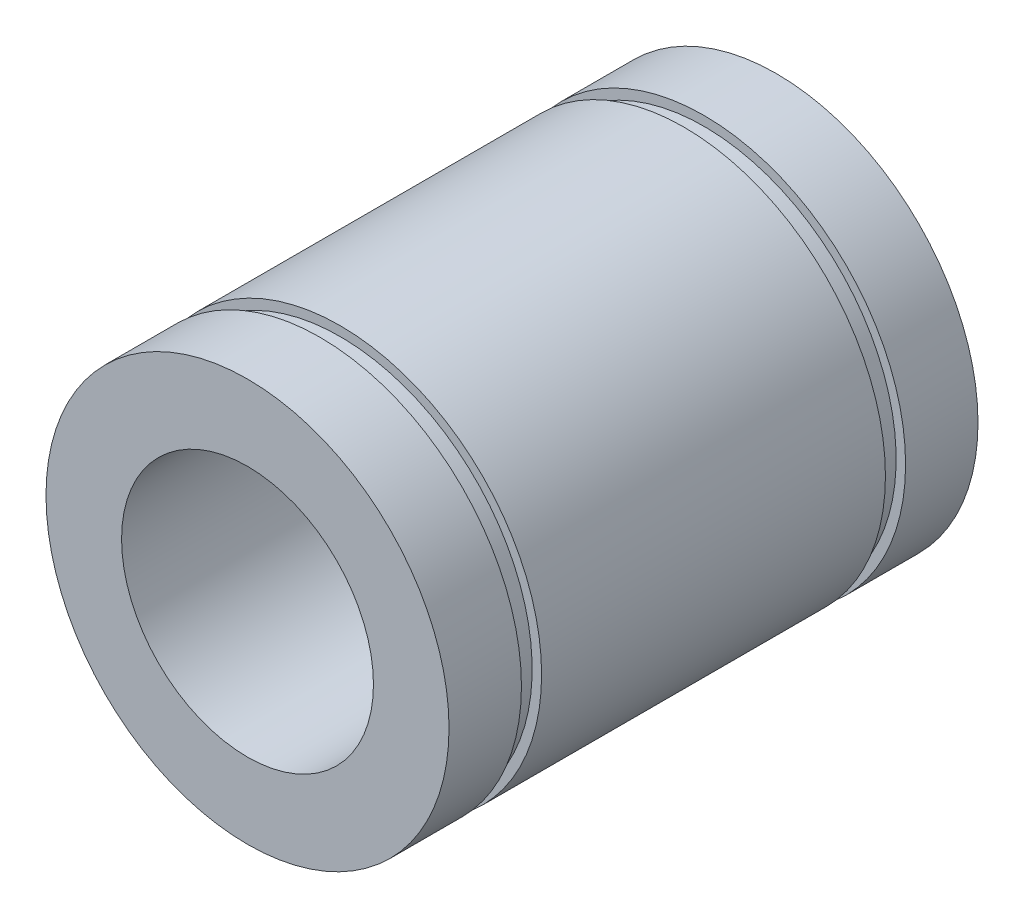
ISO-10303-21;
HEADER;
FILE_DESCRIPTION(('STEP AP214'),'2;1');
FILE_NAME('part.step','',(''),(''),'','','');
FILE_SCHEMA(('AUTOMOTIVE_DESIGN { 1 0 10303 214 1 1 1 1 }'));
ENDSEC;
DATA;
#1=APPLICATION_CONTEXT('core data for automotive mechanical design processes');
#2=APPLICATION_PROTOCOL_DEFINITION('international standard','automotive_design',2000,#1);
#3=PRODUCT_CONTEXT('',#1,'mechanical');
#4=PRODUCT('Part','Part','',(#3));
#5=PRODUCT_RELATED_PRODUCT_CATEGORY('part','',(#4));
#6=PRODUCT_DEFINITION_FORMATION('','',#4);
#7=PRODUCT_DEFINITION_CONTEXT('part definition',#1,'design');
#8=PRODUCT_DEFINITION('design','',#6,#7);
#9=PRODUCT_DEFINITION_SHAPE('','',#8);
#10=(LENGTH_UNIT() NAMED_UNIT(*) SI_UNIT(.MILLI.,.METRE.));
#11=(NAMED_UNIT(*) PLANE_ANGLE_UNIT() SI_UNIT($,.RADIAN.));
#12=(NAMED_UNIT(*) SI_UNIT($,.STERADIAN.) SOLID_ANGLE_UNIT());
#13=UNCERTAINTY_MEASURE_WITH_UNIT(LENGTH_MEASURE(1.E-05),#10,'distance_accuracy_value','');
#14=(GEOMETRIC_REPRESENTATION_CONTEXT(3) GLOBAL_UNCERTAINTY_ASSIGNED_CONTEXT((#13)) GLOBAL_UNIT_ASSIGNED_CONTEXT((#10,
#11,#12)) REPRESENTATION_CONTEXT('',''));
#15=CARTESIAN_POINT('',(0.,0.,0.));
#16=DIRECTION('',(0.,0.,1.));
#17=DIRECTION('',(1.,0.,0.));
#18=AXIS2_PLACEMENT_3D('',#15,#16,#17);
#19=CARTESIAN_POINT('',(-10.,0.,42.));
#20=DIRECTION('',(0.,0.,-1.));
#21=DIRECTION('',(-1.,0.,0.));
#22=AXIS2_PLACEMENT_3D('',#19,#20,#21);
#23=PLANE('',#22);
#24=CARTESIAN_POINT('',(0.,0.,42.));
#25=DIRECTION('',(0.,0.,-1.));
#26=DIRECTION('',(-1.,0.,0.));
#27=AXIS2_PLACEMENT_3D('',#24,#25,#26);
#28=CIRCLE('',#27,16.);
#29=CARTESIAN_POINT('',(-16.,0.,42.));
#30=VERTEX_POINT('',#29);
#31=EDGE_CURVE('E10',#30,#30,#28,.T.);
#32=ORIENTED_EDGE('',*,*,#31,.F.);
#33=EDGE_LOOP('',(#32));
#34=FACE_BOUND('',#33,.T.);
#35=CARTESIAN_POINT('',(0.,0.,42.));
#36=DIRECTION('',(0.,0.,-1.));
#37=DIRECTION('',(-1.,0.,0.));
#38=AXIS2_PLACEMENT_3D('',#35,#36,#37);
#39=CIRCLE('',#38,10.);
#40=CARTESIAN_POINT('',(-10.,0.,42.));
#41=VERTEX_POINT('',#40);
#42=EDGE_CURVE('E70',#41,#41,#39,.T.);
#43=ORIENTED_EDGE('',*,*,#42,.T.);
#44=EDGE_LOOP('',(#43));
#45=FACE_BOUND('',#44,.T.);
#46=ADVANCED_FACE('F30',(#34,#45),#23,.F.);
#47=CARTESIAN_POINT('',(0.,0.,0.));
#48=DIRECTION('',(0.,0.,-1.));
#49=DIRECTION('',(-1.,0.,0.));
#50=AXIS2_PLACEMENT_3D('',#47,#48,#49);
#51=CYLINDRICAL_SURFACE('',#50,16.);
#52=CARTESIAN_POINT('',(0.,0.,36.25));
#53=DIRECTION('',(0.,0.,-1.));
#54=DIRECTION('',(-1.,0.,0.));
#55=AXIS2_PLACEMENT_3D('',#52,#53,#54);
#56=CIRCLE('',#55,16.);
#57=CARTESIAN_POINT('',(-16.,0.,36.25));
#58=VERTEX_POINT('',#57);
#59=EDGE_CURVE('E36',#58,#58,#56,.T.);
#60=ORIENTED_EDGE('',*,*,#59,.F.);
#61=EDGE_LOOP('',(#60));
#62=FACE_BOUND('',#61,.T.);
#63=ORIENTED_EDGE('',*,*,#31,.T.);
#64=EDGE_LOOP('',(#63));
#65=FACE_BOUND('',#64,.T.);
#66=ADVANCED_FACE('F131',(#62,#65),#51,.T.);
#67=CARTESIAN_POINT('',(-16.,0.,36.25));
#68=DIRECTION('',(0.,0.,1.));
#69=DIRECTION('',(1.,0.,0.));
#70=AXIS2_PLACEMENT_3D('',#67,#68,#69);
#71=PLANE('',#70);
#72=CARTESIAN_POINT('',(0.,0.,36.25));
#73=DIRECTION('',(0.,0.,-1.));
#74=DIRECTION('',(-1.,0.,0.));
#75=AXIS2_PLACEMENT_3D('',#72,#73,#74);
#76=CIRCLE('',#75,15.25);
#77=CARTESIAN_POINT('',(-15.25,0.,36.25));
#78=VERTEX_POINT('',#77);
#79=EDGE_CURVE('E40',#78,#78,#76,.T.);
#80=ORIENTED_EDGE('',*,*,#79,.F.);
#81=EDGE_LOOP('',(#80));
#82=FACE_BOUND('',#81,.T.);
#83=ORIENTED_EDGE('',*,*,#59,.T.);
#84=EDGE_LOOP('',(#83));
#85=FACE_BOUND('',#84,.T.);
#86=ADVANCED_FACE('F126',(#82,#85),#71,.F.);
#87=CARTESIAN_POINT('',(0.,0.,0.));
#88=DIRECTION('',(0.,0.,-1.));
#89=DIRECTION('',(-1.,0.,0.));
#90=AXIS2_PLACEMENT_3D('',#87,#88,#89);
#91=CYLINDRICAL_SURFACE('',#90,15.25);
#92=CARTESIAN_POINT('',(0.,0.,34.65));
#93=DIRECTION('',(0.,0.,-1.));
#94=DIRECTION('',(-1.,0.,0.));
#95=AXIS2_PLACEMENT_3D('',#92,#93,#94);
#96=CIRCLE('',#95,15.25);
#97=CARTESIAN_POINT('',(-15.25,0.,34.65));
#98=VERTEX_POINT('',#97);
#99=EDGE_CURVE('E44',#98,#98,#96,.T.);
#100=ORIENTED_EDGE('',*,*,#99,.F.);
#101=EDGE_LOOP('',(#100));
#102=FACE_BOUND('',#101,.T.);
#103=ORIENTED_EDGE('',*,*,#79,.T.);
#104=EDGE_LOOP('',(#103));
#105=FACE_BOUND('',#104,.T.);
#106=ADVANCED_FACE('F120',(#102,#105),#91,.T.);
#107=CARTESIAN_POINT('',(-15.25,0.,34.65));
#108=DIRECTION('',(0.,0.,-1.));
#109=DIRECTION('',(-1.,0.,0.));
#110=AXIS2_PLACEMENT_3D('',#107,#108,#109);
#111=PLANE('',#110);
#112=CARTESIAN_POINT('',(0.,0.,34.65));
#113=DIRECTION('',(0.,0.,-1.));
#114=DIRECTION('',(-1.,0.,0.));
#115=AXIS2_PLACEMENT_3D('',#112,#113,#114);
#116=CIRCLE('',#115,16.);
#117=CARTESIAN_POINT('',(-16.,0.,34.65));
#118=VERTEX_POINT('',#117);
#119=EDGE_CURVE('E49',#118,#118,#116,.T.);
#120=ORIENTED_EDGE('',*,*,#119,.F.);
#121=EDGE_LOOP('',(#120));
#122=FACE_BOUND('',#121,.T.);
#123=ORIENTED_EDGE('',*,*,#99,.T.);
#124=EDGE_LOOP('',(#123));
#125=FACE_BOUND('',#124,.T.);
#126=ADVANCED_FACE('F114',(#122,#125),#111,.F.);
#127=CARTESIAN_POINT('',(0.,0.,0.));
#128=DIRECTION('',(0.,0.,-1.));
#129=DIRECTION('',(-1.,0.,0.));
#130=AXIS2_PLACEMENT_3D('',#127,#128,#129);
#131=CYLINDRICAL_SURFACE('',#130,16.);
#132=CARTESIAN_POINT('',(0.,0.,7.35));
#133=DIRECTION('',(0.,0.,-1.));
#134=DIRECTION('',(-1.,0.,0.));
#135=AXIS2_PLACEMENT_3D('',#132,#133,#134);
#136=CIRCLE('',#135,16.);
#137=CARTESIAN_POINT('',(-16.,0.,7.35));
#138=VERTEX_POINT('',#137);
#139=EDGE_CURVE('E52',#138,#138,#136,.T.);
#140=ORIENTED_EDGE('',*,*,#139,.F.);
#141=EDGE_LOOP('',(#140));
#142=FACE_BOUND('',#141,.T.);
#143=ORIENTED_EDGE('',*,*,#119,.T.);
#144=EDGE_LOOP('',(#143));
#145=FACE_BOUND('',#144,.T.);
#146=ADVANCED_FACE('F108',(#142,#145),#131,.T.);
#147=CARTESIAN_POINT('',(-16.,0.,7.35));
#148=DIRECTION('',(0.,0.,1.));
#149=DIRECTION('',(1.,0.,0.));
#150=AXIS2_PLACEMENT_3D('',#147,#148,#149);
#151=PLANE('',#150);
#152=CARTESIAN_POINT('',(0.,0.,7.35));
#153=DIRECTION('',(0.,0.,-1.));
#154=DIRECTION('',(-1.,0.,0.));
#155=AXIS2_PLACEMENT_3D('',#152,#153,#154);
#156=CIRCLE('',#155,15.25);
#157=CARTESIAN_POINT('',(-15.25,0.,7.35));
#158=VERTEX_POINT('',#157);
#159=EDGE_CURVE('E55',#158,#158,#156,.T.);
#160=ORIENTED_EDGE('',*,*,#159,.F.);
#161=EDGE_LOOP('',(#160));
#162=FACE_BOUND('',#161,.T.);
#163=ORIENTED_EDGE('',*,*,#139,.T.);
#164=EDGE_LOOP('',(#163));
#165=FACE_BOUND('',#164,.T.);
#166=ADVANCED_FACE('F102',(#162,#165),#151,.F.);
#167=CARTESIAN_POINT('',(0.,0.,0.));
#168=DIRECTION('',(0.,0.,-1.));
#169=DIRECTION('',(-1.,0.,0.));
#170=AXIS2_PLACEMENT_3D('',#167,#168,#169);
#171=CYLINDRICAL_SURFACE('',#170,15.25);
#172=CARTESIAN_POINT('',(0.,0.,5.75));
#173=DIRECTION('',(0.,0.,-1.));
#174=DIRECTION('',(-1.,0.,0.));
#175=AXIS2_PLACEMENT_3D('',#172,#173,#174);
#176=CIRCLE('',#175,15.25);
#177=CARTESIAN_POINT('',(-15.25,0.,5.75));
#178=VERTEX_POINT('',#177);
#179=EDGE_CURVE('E58',#178,#178,#176,.T.);
#180=ORIENTED_EDGE('',*,*,#179,.F.);
#181=EDGE_LOOP('',(#180));
#182=FACE_BOUND('',#181,.T.);
#183=ORIENTED_EDGE('',*,*,#159,.T.);
#184=EDGE_LOOP('',(#183));
#185=FACE_BOUND('',#184,.T.);
#186=ADVANCED_FACE('F96',(#182,#185),#171,.T.);
#187=CARTESIAN_POINT('',(-15.25,0.,5.75));
#188=DIRECTION('',(0.,0.,-1.));
#189=DIRECTION('',(-1.,0.,0.));
#190=AXIS2_PLACEMENT_3D('',#187,#188,#189);
#191=PLANE('',#190);
#192=CARTESIAN_POINT('',(0.,0.,5.75));
#193=DIRECTION('',(0.,0.,-1.));
#194=DIRECTION('',(-1.,0.,0.));
#195=AXIS2_PLACEMENT_3D('',#192,#193,#194);
#196=CIRCLE('',#195,16.);
#197=CARTESIAN_POINT('',(-16.,0.,5.75));
#198=VERTEX_POINT('',#197);
#199=EDGE_CURVE('E61',#198,#198,#196,.T.);
#200=ORIENTED_EDGE('',*,*,#199,.F.);
#201=EDGE_LOOP('',(#200));
#202=FACE_BOUND('',#201,.T.);
#203=ORIENTED_EDGE('',*,*,#179,.T.);
#204=EDGE_LOOP('',(#203));
#205=FACE_BOUND('',#204,.T.);
#206=ADVANCED_FACE('F90',(#202,#205),#191,.F.);
#207=CARTESIAN_POINT('',(0.,0.,0.));
#208=DIRECTION('',(0.,0.,-1.));
#209=DIRECTION('',(-1.,0.,0.));
#210=AXIS2_PLACEMENT_3D('',#207,#208,#209);
#211=CYLINDRICAL_SURFACE('',#210,16.);
#212=CARTESIAN_POINT('',(0.,0.,0.));
#213=DIRECTION('',(0.,0.,-1.));
#214=DIRECTION('',(-1.,0.,0.));
#215=AXIS2_PLACEMENT_3D('',#212,#213,#214);
#216=CIRCLE('',#215,16.);
#217=CARTESIAN_POINT('',(-16.,0.,0.));
#218=VERTEX_POINT('',#217);
#219=EDGE_CURVE('E64',#218,#218,#216,.T.);
#220=ORIENTED_EDGE('',*,*,#219,.F.);
#221=EDGE_LOOP('',(#220));
#222=FACE_BOUND('',#221,.T.);
#223=ORIENTED_EDGE('',*,*,#199,.T.);
#224=EDGE_LOOP('',(#223));
#225=FACE_BOUND('',#224,.T.);
#226=ADVANCED_FACE('F84',(#222,#225),#211,.T.);
#227=CARTESIAN_POINT('',(-16.,0.,0.));
#228=DIRECTION('',(0.,0.,1.));
#229=DIRECTION('',(1.,0.,0.));
#230=AXIS2_PLACEMENT_3D('',#227,#228,#229);
#231=PLANE('',#230);
#232=CARTESIAN_POINT('',(0.,0.,0.));
#233=DIRECTION('',(0.,0.,-1.));
#234=DIRECTION('',(-1.,0.,0.));
#235=AXIS2_PLACEMENT_3D('',#232,#233,#234);
#236=CIRCLE('',#235,10.);
#237=CARTESIAN_POINT('',(-10.,0.,0.));
#238=VERTEX_POINT('',#237);
#239=EDGE_CURVE('E67',#238,#238,#236,.T.);
#240=ORIENTED_EDGE('',*,*,#239,.F.);
#241=EDGE_LOOP('',(#240));
#242=FACE_BOUND('',#241,.T.);
#243=ORIENTED_EDGE('',*,*,#219,.T.);
#244=EDGE_LOOP('',(#243));
#245=FACE_BOUND('',#244,.T.);
#246=ADVANCED_FACE('F78',(#242,#245),#231,.F.);
#247=CARTESIAN_POINT('',(0.,0.,0.));
#248=DIRECTION('',(0.,0.,-1.));
#249=DIRECTION('',(-1.,0.,0.));
#250=AXIS2_PLACEMENT_3D('',#247,#248,#249);
#251=CYLINDRICAL_SURFACE('',#250,10.);
#252=ORIENTED_EDGE('',*,*,#42,.F.);
#253=EDGE_LOOP('',(#252));
#254=FACE_BOUND('',#253,.T.);
#255=ORIENTED_EDGE('',*,*,#239,.T.);
#256=EDGE_LOOP('',(#255));
#257=FACE_BOUND('',#256,.T.);
#258=ADVANCED_FACE('F75',(#254,#257),#251,.F.);
#259=CLOSED_SHELL('',(#46,#66,#86,#106,#126,#146,#166,#186,#206,#226,#246,#258));
#260=MANIFOLD_SOLID_BREP('B2',#259);
#261=ADVANCED_BREP_SHAPE_REPRESENTATION('',(#18,#260),#14);
#262=SHAPE_DEFINITION_REPRESENTATION(#9,#261);
ENDSEC;
END-ISO-10303-21;
